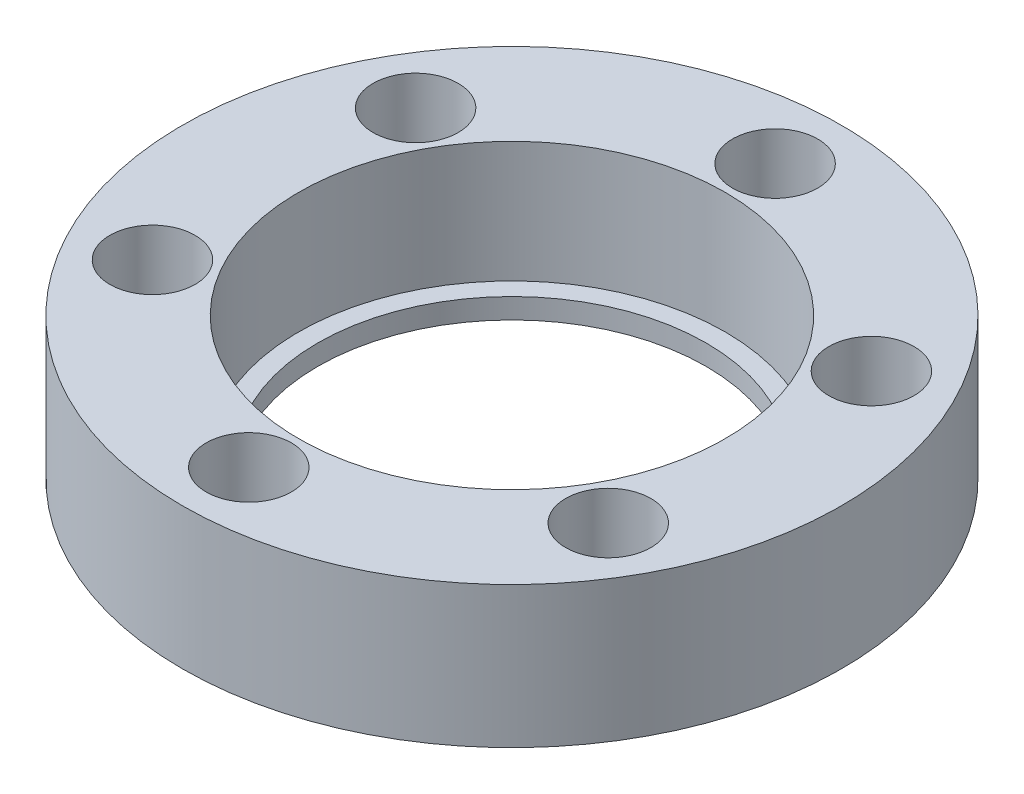
ISO-10303-21;
HEADER;
FILE_DESCRIPTION(('STEP AP214'),'2;1');
FILE_NAME('part.step','',(''),(''),'','','');
FILE_SCHEMA(('AUTOMOTIVE_DESIGN { 1 0 10303 214 1 1 1 1 }'));
ENDSEC;
DATA;
#1=APPLICATION_CONTEXT('core data for automotive mechanical design processes');
#2=APPLICATION_PROTOCOL_DEFINITION('international standard','automotive_design',2000,#1);
#3=PRODUCT_CONTEXT('',#1,'mechanical');
#4=PRODUCT('Part','Part','',(#3));
#5=PRODUCT_RELATED_PRODUCT_CATEGORY('part','',(#4));
#6=PRODUCT_DEFINITION_FORMATION('','',#4);
#7=PRODUCT_DEFINITION_CONTEXT('part definition',#1,'design');
#8=PRODUCT_DEFINITION('design','',#6,#7);
#9=PRODUCT_DEFINITION_SHAPE('','',#8);
#10=(LENGTH_UNIT() NAMED_UNIT(*) SI_UNIT(.MILLI.,.METRE.));
#11=(NAMED_UNIT(*) PLANE_ANGLE_UNIT() SI_UNIT($,.RADIAN.));
#12=(NAMED_UNIT(*) SI_UNIT($,.STERADIAN.) SOLID_ANGLE_UNIT());
#13=UNCERTAINTY_MEASURE_WITH_UNIT(LENGTH_MEASURE(1.E-05),#10,'distance_accuracy_value','');
#14=(GEOMETRIC_REPRESENTATION_CONTEXT(3) GLOBAL_UNCERTAINTY_ASSIGNED_CONTEXT((#13)) GLOBAL_UNIT_ASSIGNED_CONTEXT((#10,
#11,#12)) REPRESENTATION_CONTEXT('',''));
#15=CARTESIAN_POINT('',(0.,0.,0.));
#16=DIRECTION('',(0.,0.,1.));
#17=DIRECTION('',(1.,0.,0.));
#18=AXIS2_PLACEMENT_3D('',#15,#16,#17);
#19=CARTESIAN_POINT('',(0.,7.239,0.));
#20=DIRECTION('',(0.,-1.,0.));
#21=DIRECTION('',(0.,0.,-1.));
#22=AXIS2_PLACEMENT_3D('',#19,#20,#21);
#23=CYLINDRICAL_SURFACE('',#22,10.9347);
#24=CARTESIAN_POINT('',(0.,7.239,0.));
#25=DIRECTION('',(0.,-1.,0.));
#26=DIRECTION('',(0.,0.,-1.));
#27=AXIS2_PLACEMENT_3D('',#24,#25,#26);
#28=CIRCLE('',#27,10.9347);
#29=CARTESIAN_POINT('',(0.,7.239,-10.9347));
#30=VERTEX_POINT('',#29);
#31=EDGE_CURVE('E45',#30,#30,#28,.T.);
#32=ORIENTED_EDGE('',*,*,#31,.F.);
#33=EDGE_LOOP('',(#32));
#34=FACE_BOUND('',#33,.T.);
#35=CARTESIAN_POINT('',(0.,1.0414,0.));
#36=DIRECTION('',(0.,-1.,0.));
#37=DIRECTION('',(0.,0.,-1.));
#38=AXIS2_PLACEMENT_3D('',#35,#36,#37);
#39=CIRCLE('',#38,10.9347);
#40=CARTESIAN_POINT('',(0.,1.0414,-10.9347));
#41=VERTEX_POINT('',#40);
#42=EDGE_CURVE('E10',#41,#41,#39,.F.);
#43=ORIENTED_EDGE('',*,*,#42,.F.);
#44=EDGE_LOOP('',(#43));
#45=FACE_BOUND('',#44,.T.);
#46=ADVANCED_FACE('F29',(#34,#45),#23,.F.);
#47=CARTESIAN_POINT('',(0.,7.239,0.));
#48=DIRECTION('',(0.,-1.,0.));
#49=DIRECTION('',(0.,0.,-1.));
#50=AXIS2_PLACEMENT_3D('',#47,#48,#49);
#51=CYLINDRICAL_SURFACE('',#50,16.891);
#52=CARTESIAN_POINT('',(0.,7.239,0.));
#53=DIRECTION('',(0.,1.,0.));
#54=DIRECTION('',(0.,0.,1.));
#55=AXIS2_PLACEMENT_3D('',#52,#53,#54);
#56=CIRCLE('',#55,16.891);
#57=CARTESIAN_POINT('',(0.,7.239,16.891));
#58=VERTEX_POINT('',#57);
#59=EDGE_CURVE('E36',#58,#58,#56,.T.);
#60=ORIENTED_EDGE('',*,*,#59,.F.);
#61=EDGE_LOOP('',(#60));
#62=FACE_BOUND('',#61,.T.);
#63=CARTESIAN_POINT('',(0.,0.,0.));
#64=DIRECTION('',(0.,1.,0.));
#65=DIRECTION('',(0.,0.,1.));
#66=AXIS2_PLACEMENT_3D('',#63,#64,#65);
#67=CIRCLE('',#66,16.891);
#68=CARTESIAN_POINT('',(0.,0.,16.891));
#69=VERTEX_POINT('',#68);
#70=EDGE_CURVE('E40',#69,#69,#67,.T.);
#71=ORIENTED_EDGE('',*,*,#70,.T.);
#72=EDGE_LOOP('',(#71));
#73=FACE_BOUND('',#72,.T.);
#74=ADVANCED_FACE('F31',(#62,#73),#51,.T.);
#75=CARTESIAN_POINT('',(0.,7.239,0.));
#76=DIRECTION('',(0.,1.,0.));
#77=DIRECTION('',(0.,0.,1.));
#78=AXIS2_PLACEMENT_3D('',#75,#76,#77);
#79=PLANE('',#78);
#80=CARTESIAN_POINT('',(-11.6804310310022,7.239,-6.74370000000014));
#81=DIRECTION('',(0.,1.,0.));
#82=DIRECTION('',(0.866025403784433,0.,0.50000000000001));
#83=AXIS2_PLACEMENT_3D('',#80,#81,#82);
#84=CIRCLE('',#83,2.1844);
#85=CARTESIAN_POINT('',(-9.78868513897544,7.239,-5.65150000000011));
#86=VERTEX_POINT('',#85);
#87=EDGE_CURVE('E86',#86,#86,#84,.T.);
#88=ORIENTED_EDGE('',*,*,#87,.F.);
#89=EDGE_LOOP('',(#88));
#90=FACE_BOUND('',#89,.T.);
#91=CARTESIAN_POINT('',(-11.6804310310023,7.239,6.74369999999989));
#92=DIRECTION('',(0.,1.,0.));
#93=DIRECTION('',(0.866025403784443,0.,-0.499999999999992));
#94=AXIS2_PLACEMENT_3D('',#91,#92,#93);
#95=CIRCLE('',#94,2.1844);
#96=CARTESIAN_POINT('',(-9.78868513897556,7.239,5.65149999999991));
#97=VERTEX_POINT('',#96);
#98=EDGE_CURVE('E80',#97,#97,#95,.T.);
#99=ORIENTED_EDGE('',*,*,#98,.F.);
#100=EDGE_LOOP('',(#99));
#101=FACE_BOUND('',#100,.T.);
#102=CARTESIAN_POINT('',(0.,7.239,13.4874));
#103=DIRECTION('',(0.,1.,0.));
#104=DIRECTION('',(0.,0.,-1.));
#105=AXIS2_PLACEMENT_3D('',#102,#103,#104);
#106=CIRCLE('',#105,2.1844);
#107=CARTESIAN_POINT('',(0.,7.239,11.303));
#108=VERTEX_POINT('',#107);
#109=EDGE_CURVE('E74',#108,#108,#106,.T.);
#110=ORIENTED_EDGE('',*,*,#109,.F.);
#111=EDGE_LOOP('',(#110));
#112=FACE_BOUND('',#111,.T.);
#113=CARTESIAN_POINT('',(11.6804310310022,7.239,6.74370000000006));
#114=DIRECTION('',(0.,1.,0.));
#115=DIRECTION('',(-0.866025403784436,0.,-0.500000000000004));
#116=AXIS2_PLACEMENT_3D('',#113,#114,#115);
#117=CIRCLE('',#116,2.1844);
#118=CARTESIAN_POINT('',(9.78868513897549,7.239,5.65150000000005));
#119=VERTEX_POINT('',#118);
#120=EDGE_CURVE('E68',#119,#119,#117,.T.);
#121=ORIENTED_EDGE('',*,*,#120,.F.);
#122=EDGE_LOOP('',(#121));
#123=FACE_BOUND('',#122,.T.);
#124=CARTESIAN_POINT('',(11.6804310310023,7.239,-6.74369999999997));
#125=DIRECTION('',(0.,1.,0.));
#126=DIRECTION('',(-0.86602540378444,0.,0.499999999999998));
#127=AXIS2_PLACEMENT_3D('',#124,#125,#126);
#128=CIRCLE('',#127,2.1844);
#129=CARTESIAN_POINT('',(9.78868513897552,7.239,-5.65149999999998));
#130=VERTEX_POINT('',#129);
#131=EDGE_CURVE('E62',#130,#130,#128,.T.);
#132=ORIENTED_EDGE('',*,*,#131,.F.);
#133=EDGE_LOOP('',(#132));
#134=FACE_BOUND('',#133,.T.);
#135=CARTESIAN_POINT('',(0.,7.239,-13.4874));
#136=DIRECTION('',(0.,1.,0.));
#137=DIRECTION('',(0.,0.,1.));
#138=AXIS2_PLACEMENT_3D('',#135,#136,#137);
#139=CIRCLE('',#138,2.1844);
#140=CARTESIAN_POINT('',(0.,7.239,-11.303));
#141=VERTEX_POINT('',#140);
#142=EDGE_CURVE('E56',#141,#141,#139,.T.);
#143=ORIENTED_EDGE('',*,*,#142,.F.);
#144=EDGE_LOOP('',(#143));
#145=FACE_BOUND('',#144,.T.);
#146=ORIENTED_EDGE('',*,*,#31,.T.);
#147=EDGE_LOOP('',(#146));
#148=FACE_BOUND('',#147,.T.);
#149=ORIENTED_EDGE('',*,*,#59,.T.);
#150=EDGE_LOOP('',(#149));
#151=FACE_BOUND('',#150,.T.);
#152=ADVANCED_FACE('F102',(#90,#101,#112,#123,#134,#145,#148,#151),#79,.T.);
#153=CARTESIAN_POINT('',(0.,0.,0.));
#154=DIRECTION('',(0.,1.,0.));
#155=DIRECTION('',(0.,0.,1.));
#156=AXIS2_PLACEMENT_3D('',#153,#154,#155);
#157=PLANE('',#156);
#158=CARTESIAN_POINT('',(-11.6804310310022,0.,-6.74370000000014));
#159=DIRECTION('',(0.,1.,0.));
#160=DIRECTION('',(0.866025403784433,0.,0.50000000000001));
#161=AXIS2_PLACEMENT_3D('',#158,#159,#160);
#162=CIRCLE('',#161,2.1844);
#163=CARTESIAN_POINT('',(-9.78868513897544,0.,-5.65150000000011));
#164=VERTEX_POINT('',#163);
#165=EDGE_CURVE('E83',#164,#164,#162,.T.);
#166=ORIENTED_EDGE('',*,*,#165,.T.);
#167=EDGE_LOOP('',(#166));
#168=FACE_BOUND('',#167,.T.);
#169=CARTESIAN_POINT('',(-11.6804310310023,0.,6.74369999999989));
#170=DIRECTION('',(0.,1.,0.));
#171=DIRECTION('',(0.866025403784443,0.,-0.499999999999992));
#172=AXIS2_PLACEMENT_3D('',#169,#170,#171);
#173=CIRCLE('',#172,2.1844);
#174=CARTESIAN_POINT('',(-9.78868513897556,0.,5.65149999999991));
#175=VERTEX_POINT('',#174);
#176=EDGE_CURVE('E77',#175,#175,#173,.T.);
#177=ORIENTED_EDGE('',*,*,#176,.T.);
#178=EDGE_LOOP('',(#177));
#179=FACE_BOUND('',#178,.T.);
#180=CARTESIAN_POINT('',(0.,0.,13.4874));
#181=DIRECTION('',(0.,1.,0.));
#182=DIRECTION('',(0.,0.,-1.));
#183=AXIS2_PLACEMENT_3D('',#180,#181,#182);
#184=CIRCLE('',#183,2.1844);
#185=CARTESIAN_POINT('',(0.,0.,11.303));
#186=VERTEX_POINT('',#185);
#187=EDGE_CURVE('E71',#186,#186,#184,.T.);
#188=ORIENTED_EDGE('',*,*,#187,.T.);
#189=EDGE_LOOP('',(#188));
#190=FACE_BOUND('',#189,.T.);
#191=CARTESIAN_POINT('',(11.6804310310022,0.,6.74370000000006));
#192=DIRECTION('',(0.,1.,0.));
#193=DIRECTION('',(-0.866025403784436,0.,-0.500000000000004));
#194=AXIS2_PLACEMENT_3D('',#191,#192,#193);
#195=CIRCLE('',#194,2.1844);
#196=CARTESIAN_POINT('',(9.78868513897549,0.,5.65150000000005));
#197=VERTEX_POINT('',#196);
#198=EDGE_CURVE('E65',#197,#197,#195,.T.);
#199=ORIENTED_EDGE('',*,*,#198,.T.);
#200=EDGE_LOOP('',(#199));
#201=FACE_BOUND('',#200,.T.);
#202=CARTESIAN_POINT('',(11.6804310310023,0.,-6.74369999999997));
#203=DIRECTION('',(0.,1.,0.));
#204=DIRECTION('',(-0.86602540378444,0.,0.499999999999998));
#205=AXIS2_PLACEMENT_3D('',#202,#203,#204);
#206=CIRCLE('',#205,2.1844);
#207=CARTESIAN_POINT('',(9.78868513897552,0.,-5.65149999999998));
#208=VERTEX_POINT('',#207);
#209=EDGE_CURVE('E59',#208,#208,#206,.T.);
#210=ORIENTED_EDGE('',*,*,#209,.T.);
#211=EDGE_LOOP('',(#210));
#212=FACE_BOUND('',#211,.T.);
#213=CARTESIAN_POINT('',(0.,0.,-13.4874));
#214=DIRECTION('',(0.,1.,0.));
#215=DIRECTION('',(0.,0.,1.));
#216=AXIS2_PLACEMENT_3D('',#213,#214,#215);
#217=CIRCLE('',#216,2.1844);
#218=CARTESIAN_POINT('',(0.,0.,-11.303));
#219=VERTEX_POINT('',#218);
#220=EDGE_CURVE('E53',#219,#219,#217,.T.);
#221=ORIENTED_EDGE('',*,*,#220,.T.);
#222=EDGE_LOOP('',(#221));
#223=FACE_BOUND('',#222,.T.);
#224=ORIENTED_EDGE('',*,*,#70,.F.);
#225=EDGE_LOOP('',(#224));
#226=FACE_BOUND('',#225,.T.);
#227=CARTESIAN_POINT('',(0.,0.,0.));
#228=DIRECTION('',(0.,-1.,0.));
#229=DIRECTION('',(0.,0.,-1.));
#230=AXIS2_PLACEMENT_3D('',#227,#228,#229);
#231=CIRCLE('',#230,9.9568);
#232=CARTESIAN_POINT('',(0.,0.,-9.9568));
#233=VERTEX_POINT('',#232);
#234=EDGE_CURVE('E50',#233,#233,#231,.T.);
#235=ORIENTED_EDGE('',*,*,#234,.F.);
#236=EDGE_LOOP('',(#235));
#237=FACE_BOUND('',#236,.T.);
#238=ADVANCED_FACE('F92',(#168,#179,#190,#201,#212,#223,#226,#237),#157,.F.);
#239=CARTESIAN_POINT('',(0.,1.0414,0.));
#240=DIRECTION('',(0.,-1.,0.));
#241=DIRECTION('',(0.,0.,-1.));
#242=AXIS2_PLACEMENT_3D('',#239,#240,#241);
#243=PLANE('',#242);
#244=CARTESIAN_POINT('',(0.,1.0414,0.));
#245=DIRECTION('',(0.,-1.,0.));
#246=DIRECTION('',(0.,0.,-1.));
#247=AXIS2_PLACEMENT_3D('',#244,#245,#246);
#248=CIRCLE('',#247,9.9568);
#249=CARTESIAN_POINT('',(0.,1.0414,-9.9568));
#250=VERTEX_POINT('',#249);
#251=EDGE_CURVE('E49',#250,#250,#248,.T.);
#252=ORIENTED_EDGE('',*,*,#251,.T.);
#253=EDGE_LOOP('',(#252));
#254=FACE_BOUND('',#253,.T.);
#255=ORIENTED_EDGE('',*,*,#42,.T.);
#256=EDGE_LOOP('',(#255));
#257=FACE_BOUND('',#256,.T.);
#258=ADVANCED_FACE('F126',(#254,#257),#243,.F.);
#259=CARTESIAN_POINT('',(0.,1.0414,0.));
#260=DIRECTION('',(0.,-1.,0.));
#261=DIRECTION('',(0.,0.,-1.));
#262=AXIS2_PLACEMENT_3D('',#259,#260,#261);
#263=CYLINDRICAL_SURFACE('',#262,9.9568);
#264=ORIENTED_EDGE('',*,*,#251,.F.);
#265=EDGE_LOOP('',(#264));
#266=FACE_BOUND('',#265,.T.);
#267=ORIENTED_EDGE('',*,*,#234,.T.);
#268=EDGE_LOOP('',(#267));
#269=FACE_BOUND('',#268,.T.);
#270=ADVANCED_FACE('F132',(#266,#269),#263,.F.);
#271=CARTESIAN_POINT('',(0.,0.,-13.4874));
#272=DIRECTION('',(0.,1.,0.));
#273=DIRECTION('',(0.,0.,1.));
#274=AXIS2_PLACEMENT_3D('',#271,#272,#273);
#275=CYLINDRICAL_SURFACE('',#274,2.1844);
#276=ORIENTED_EDGE('',*,*,#220,.F.);
#277=EDGE_LOOP('',(#276));
#278=FACE_BOUND('',#277,.T.);
#279=ORIENTED_EDGE('',*,*,#142,.T.);
#280=EDGE_LOOP('',(#279));
#281=FACE_BOUND('',#280,.T.);
#282=ADVANCED_FACE('F137',(#278,#281),#275,.F.);
#283=CARTESIAN_POINT('',(11.6804310310023,0.,-6.74369999999997));
#284=DIRECTION('',(0.,1.,0.));
#285=DIRECTION('',(0.,0.,1.));
#286=AXIS2_PLACEMENT_3D('',#283,#284,#285);
#287=CYLINDRICAL_SURFACE('',#286,2.1844);
#288=ORIENTED_EDGE('',*,*,#209,.F.);
#289=EDGE_LOOP('',(#288));
#290=FACE_BOUND('',#289,.T.);
#291=ORIENTED_EDGE('',*,*,#131,.T.);
#292=EDGE_LOOP('',(#291));
#293=FACE_BOUND('',#292,.T.);
#294=ADVANCED_FACE('F146',(#290,#293),#287,.F.);
#295=CARTESIAN_POINT('',(11.6804310310022,0.,6.74370000000006));
#296=DIRECTION('',(0.,1.,0.));
#297=DIRECTION('',(0.,0.,1.));
#298=AXIS2_PLACEMENT_3D('',#295,#296,#297);
#299=CYLINDRICAL_SURFACE('',#298,2.1844);
#300=ORIENTED_EDGE('',*,*,#198,.F.);
#301=EDGE_LOOP('',(#300));
#302=FACE_BOUND('',#301,.T.);
#303=ORIENTED_EDGE('',*,*,#120,.T.);
#304=EDGE_LOOP('',(#303));
#305=FACE_BOUND('',#304,.T.);
#306=ADVANCED_FACE('F152',(#302,#305),#299,.F.);
#307=CARTESIAN_POINT('',(0.,0.,13.4874));
#308=DIRECTION('',(0.,1.,0.));
#309=DIRECTION('',(0.,0.,1.));
#310=AXIS2_PLACEMENT_3D('',#307,#308,#309);
#311=CYLINDRICAL_SURFACE('',#310,2.1844);
#312=ORIENTED_EDGE('',*,*,#187,.F.);
#313=EDGE_LOOP('',(#312));
#314=FACE_BOUND('',#313,.T.);
#315=ORIENTED_EDGE('',*,*,#109,.T.);
#316=EDGE_LOOP('',(#315));
#317=FACE_BOUND('',#316,.T.);
#318=ADVANCED_FACE('F156',(#314,#317),#311,.F.);
#319=CARTESIAN_POINT('',(-11.6804310310023,0.,6.74369999999989));
#320=DIRECTION('',(0.,1.,0.));
#321=DIRECTION('',(0.,0.,1.));
#322=AXIS2_PLACEMENT_3D('',#319,#320,#321);
#323=CYLINDRICAL_SURFACE('',#322,2.1844);
#324=ORIENTED_EDGE('',*,*,#176,.F.);
#325=EDGE_LOOP('',(#324));
#326=FACE_BOUND('',#325,.T.);
#327=ORIENTED_EDGE('',*,*,#98,.T.);
#328=EDGE_LOOP('',(#327));
#329=FACE_BOUND('',#328,.T.);
#330=ADVANCED_FACE('F98',(#326,#329),#323,.F.);
#331=CARTESIAN_POINT('',(-11.6804310310022,0.,-6.74370000000014));
#332=DIRECTION('',(0.,1.,0.));
#333=DIRECTION('',(0.,0.,1.));
#334=AXIS2_PLACEMENT_3D('',#331,#332,#333);
#335=CYLINDRICAL_SURFACE('',#334,2.1844);
#336=ORIENTED_EDGE('',*,*,#165,.F.);
#337=EDGE_LOOP('',(#336));
#338=FACE_BOUND('',#337,.T.);
#339=ORIENTED_EDGE('',*,*,#87,.T.);
#340=EDGE_LOOP('',(#339));
#341=FACE_BOUND('',#340,.T.);
#342=ADVANCED_FACE('F95',(#338,#341),#335,.F.);
#343=CLOSED_SHELL('',(#46,#74,#152,#238,#258,#270,#282,#294,#306,#318,#330,#342));
#344=MANIFOLD_SOLID_BREP('B2',#343);
#345=ADVANCED_BREP_SHAPE_REPRESENTATION('',(#18,#344),#14);
#346=SHAPE_DEFINITION_REPRESENTATION(#9,#345);
ENDSEC;
END-ISO-10303-21;
